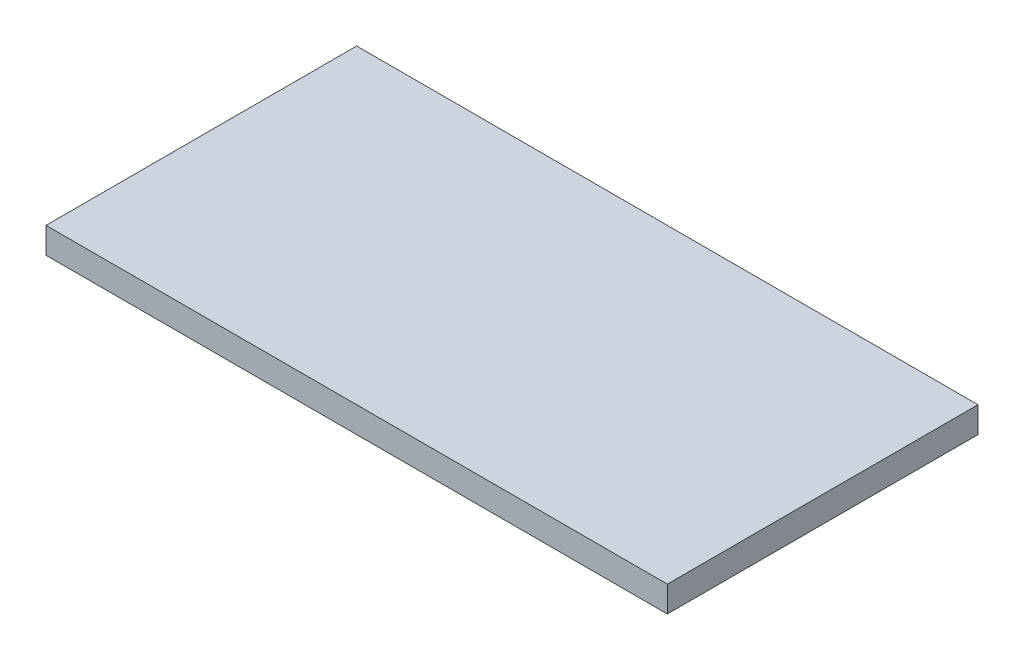
ISO-10303-21;
HEADER;
FILE_DESCRIPTION(('STEP AP214'),'2;1');
FILE_NAME('part.step','',(''),(''),'','','');
FILE_SCHEMA(('AUTOMOTIVE_DESIGN { 1 0 10303 214 1 1 1 1 }'));
ENDSEC;
DATA;
#1=APPLICATION_CONTEXT('core data for automotive mechanical design processes');
#2=APPLICATION_PROTOCOL_DEFINITION('international standard','automotive_design',2000,#1);
#3=PRODUCT_CONTEXT('',#1,'mechanical');
#4=PRODUCT('Part','Part','',(#3));
#5=PRODUCT_RELATED_PRODUCT_CATEGORY('part','',(#4));
#6=PRODUCT_DEFINITION_FORMATION('','',#4);
#7=PRODUCT_DEFINITION_CONTEXT('part definition',#1,'design');
#8=PRODUCT_DEFINITION('design','',#6,#7);
#9=PRODUCT_DEFINITION_SHAPE('','',#8);
#10=(LENGTH_UNIT() NAMED_UNIT(*) SI_UNIT(.MILLI.,.METRE.));
#11=(NAMED_UNIT(*) PLANE_ANGLE_UNIT() SI_UNIT($,.RADIAN.));
#12=(NAMED_UNIT(*) SI_UNIT($,.STERADIAN.) SOLID_ANGLE_UNIT());
#13=UNCERTAINTY_MEASURE_WITH_UNIT(LENGTH_MEASURE(1.E-05),#10,'distance_accuracy_value','');
#14=(GEOMETRIC_REPRESENTATION_CONTEXT(3) GLOBAL_UNCERTAINTY_ASSIGNED_CONTEXT((#13)) GLOBAL_UNIT_ASSIGNED_CONTEXT((#10,
#11,#12)) REPRESENTATION_CONTEXT('',''));
#15=CARTESIAN_POINT('',(0.,0.,0.));
#16=DIRECTION('',(0.,0.,1.));
#17=DIRECTION('',(1.,0.,0.));
#18=AXIS2_PLACEMENT_3D('',#15,#16,#17);
#19=CARTESIAN_POINT('',(0.,0.,-30.));
#20=DIRECTION('',(0.,-1.,0.));
#21=DIRECTION('',(0.,0.,-1.));
#22=AXIS2_PLACEMENT_3D('',#19,#20,#21);
#23=PLANE('',#22);
#24=DIRECTION('',(0.,0.,1.));
#25=VECTOR('',#24,1.);
#26=CARTESIAN_POINT('',(60.,0.,0.));
#27=LINE('',#26,#25);
#28=CARTESIAN_POINT('',(60.,0.,-30.));
#29=VERTEX_POINT('',#28);
#30=CARTESIAN_POINT('',(60.,0.,0.));
#31=VERTEX_POINT('',#30);
#32=EDGE_CURVE('E54',#29,#31,#27,.T.);
#33=ORIENTED_EDGE('',*,*,#32,.T.);
#34=DIRECTION('',(-1.,0.,0.));
#35=VECTOR('',#34,1.);
#36=CARTESIAN_POINT('',(0.,0.,0.));
#37=LINE('',#36,#35);
#38=CARTESIAN_POINT('',(0.,0.,0.));
#39=VERTEX_POINT('',#38);
#40=EDGE_CURVE('E75',#31,#39,#37,.T.);
#41=ORIENTED_EDGE('',*,*,#40,.T.);
#42=DIRECTION('',(0.,0.,-1.));
#43=VECTOR('',#42,1.);
#44=CARTESIAN_POINT('',(0.,0.,0.));
#45=LINE('',#44,#43);
#46=CARTESIAN_POINT('',(0.,0.,-30.));
#47=VERTEX_POINT('',#46);
#48=EDGE_CURVE('E57',#39,#47,#45,.T.);
#49=ORIENTED_EDGE('',*,*,#48,.T.);
#50=DIRECTION('',(1.,0.,0.));
#51=VECTOR('',#50,1.);
#52=CARTESIAN_POINT('',(0.,0.,-30.));
#53=LINE('',#52,#51);
#54=EDGE_CURVE('E19',#47,#29,#53,.T.);
#55=ORIENTED_EDGE('',*,*,#54,.T.);
#56=EDGE_LOOP('',(#33,#41,#49,#55));
#57=FACE_BOUND('',#56,.T.);
#58=ADVANCED_FACE('F16',(#57),#23,.T.);
#59=CARTESIAN_POINT('',(0.,2.5,-30.));
#60=DIRECTION('',(0.,0.,1.));
#61=DIRECTION('',(1.,0.,0.));
#62=AXIS2_PLACEMENT_3D('',#59,#60,#61);
#63=PLANE('',#62);
#64=DIRECTION('',(0.,1.,0.));
#65=VECTOR('',#64,1.);
#66=CARTESIAN_POINT('',(0.,2.5,-30.));
#67=LINE('',#66,#65);
#68=CARTESIAN_POINT('',(0.,2.5,-30.));
#69=VERTEX_POINT('',#68);
#70=EDGE_CURVE('E77',#47,#69,#67,.T.);
#71=ORIENTED_EDGE('',*,*,#70,.T.);
#72=DIRECTION('',(1.,0.,0.));
#73=VECTOR('',#72,1.);
#74=CARTESIAN_POINT('',(0.,2.5,-30.));
#75=LINE('',#74,#73);
#76=CARTESIAN_POINT('',(60.,2.5,-30.));
#77=VERTEX_POINT('',#76);
#78=EDGE_CURVE('E72',#69,#77,#75,.T.);
#79=ORIENTED_EDGE('',*,*,#78,.T.);
#80=DIRECTION('',(0.,1.,0.));
#81=VECTOR('',#80,1.);
#82=CARTESIAN_POINT('',(60.,2.5,-30.));
#83=LINE('',#82,#81);
#84=EDGE_CURVE('E62',#77,#29,#83,.F.);
#85=ORIENTED_EDGE('',*,*,#84,.T.);
#86=ORIENTED_EDGE('',*,*,#54,.F.);
#87=EDGE_LOOP('',(#71,#79,#85,#86));
#88=FACE_BOUND('',#87,.T.);
#89=ADVANCED_FACE('F71',(#88),#63,.F.);
#90=CARTESIAN_POINT('',(60.,2.5,0.));
#91=DIRECTION('',(-1.,0.,0.));
#92=DIRECTION('',(0.,0.,1.));
#93=AXIS2_PLACEMENT_3D('',#90,#91,#92);
#94=PLANE('',#93);
#95=ORIENTED_EDGE('',*,*,#84,.F.);
#96=DIRECTION('',(0.,0.,-1.));
#97=VECTOR('',#96,1.);
#98=CARTESIAN_POINT('',(60.,2.5,-30.));
#99=LINE('',#98,#97);
#100=CARTESIAN_POINT('',(60.,2.5,0.));
#101=VERTEX_POINT('',#100);
#102=EDGE_CURVE('E82',#77,#101,#99,.F.);
#103=ORIENTED_EDGE('',*,*,#102,.T.);
#104=DIRECTION('',(0.,1.,0.));
#105=VECTOR('',#104,1.);
#106=CARTESIAN_POINT('',(60.,2.5,0.));
#107=LINE('',#106,#105);
#108=EDGE_CURVE('E68',#101,#31,#107,.F.);
#109=ORIENTED_EDGE('',*,*,#108,.T.);
#110=ORIENTED_EDGE('',*,*,#32,.F.);
#111=EDGE_LOOP('',(#95,#103,#109,#110));
#112=FACE_BOUND('',#111,.T.);
#113=ADVANCED_FACE('F65',(#112),#94,.F.);
#114=CARTESIAN_POINT('',(0.,2.5,0.));
#115=DIRECTION('',(0.,0.,-1.));
#116=DIRECTION('',(-1.,0.,0.));
#117=AXIS2_PLACEMENT_3D('',#114,#115,#116);
#118=PLANE('',#117);
#119=ORIENTED_EDGE('',*,*,#108,.F.);
#120=DIRECTION('',(1.,0.,0.));
#121=VECTOR('',#120,1.);
#122=CARTESIAN_POINT('',(0.,2.5,0.));
#123=LINE('',#122,#121);
#124=CARTESIAN_POINT('',(0.,2.5,0.));
#125=VERTEX_POINT('',#124);
#126=EDGE_CURVE('E25',#101,#125,#123,.F.);
#127=ORIENTED_EDGE('',*,*,#126,.T.);
#128=DIRECTION('',(0.,1.,0.));
#129=VECTOR('',#128,1.);
#130=CARTESIAN_POINT('',(0.,2.5,0.));
#131=LINE('',#130,#129);
#132=EDGE_CURVE('E33',#125,#39,#131,.F.);
#133=ORIENTED_EDGE('',*,*,#132,.T.);
#134=ORIENTED_EDGE('',*,*,#40,.F.);
#135=EDGE_LOOP('',(#119,#127,#133,#134));
#136=FACE_BOUND('',#135,.T.);
#137=ADVANCED_FACE('F87',(#136),#118,.F.);
#138=CARTESIAN_POINT('',(0.,2.5,0.));
#139=DIRECTION('',(1.,0.,0.));
#140=DIRECTION('',(0.,0.,-1.));
#141=AXIS2_PLACEMENT_3D('',#138,#139,#140);
#142=PLANE('',#141);
#143=ORIENTED_EDGE('',*,*,#132,.F.);
#144=DIRECTION('',(0.,0.,-1.));
#145=VECTOR('',#144,1.);
#146=CARTESIAN_POINT('',(0.,2.5,-30.));
#147=LINE('',#146,#145);
#148=EDGE_CURVE('E11',#125,#69,#147,.T.);
#149=ORIENTED_EDGE('',*,*,#148,.T.);
#150=ORIENTED_EDGE('',*,*,#70,.F.);
#151=ORIENTED_EDGE('',*,*,#48,.F.);
#152=EDGE_LOOP('',(#143,#149,#150,#151));
#153=FACE_BOUND('',#152,.T.);
#154=ADVANCED_FACE('F90',(#153),#142,.F.);
#155=CARTESIAN_POINT('',(0.,2.5,-30.));
#156=DIRECTION('',(0.,-1.,0.));
#157=DIRECTION('',(0.,0.,-1.));
#158=AXIS2_PLACEMENT_3D('',#155,#156,#157);
#159=PLANE('',#158);
#160=ORIENTED_EDGE('',*,*,#126,.F.);
#161=ORIENTED_EDGE('',*,*,#102,.F.);
#162=ORIENTED_EDGE('',*,*,#78,.F.);
#163=ORIENTED_EDGE('',*,*,#148,.F.);
#164=EDGE_LOOP('',(#160,#161,#162,#163));
#165=FACE_BOUND('',#164,.T.);
#166=ADVANCED_FACE('F89',(#165),#159,.F.);
#167=CLOSED_SHELL('',(#58,#89,#113,#137,#154,#166));
#168=MANIFOLD_SOLID_BREP('B1',#167);
#169=ADVANCED_BREP_SHAPE_REPRESENTATION('',(#18,#168),#14);
#170=SHAPE_DEFINITION_REPRESENTATION(#9,#169);
ENDSEC;
END-ISO-10303-21;
